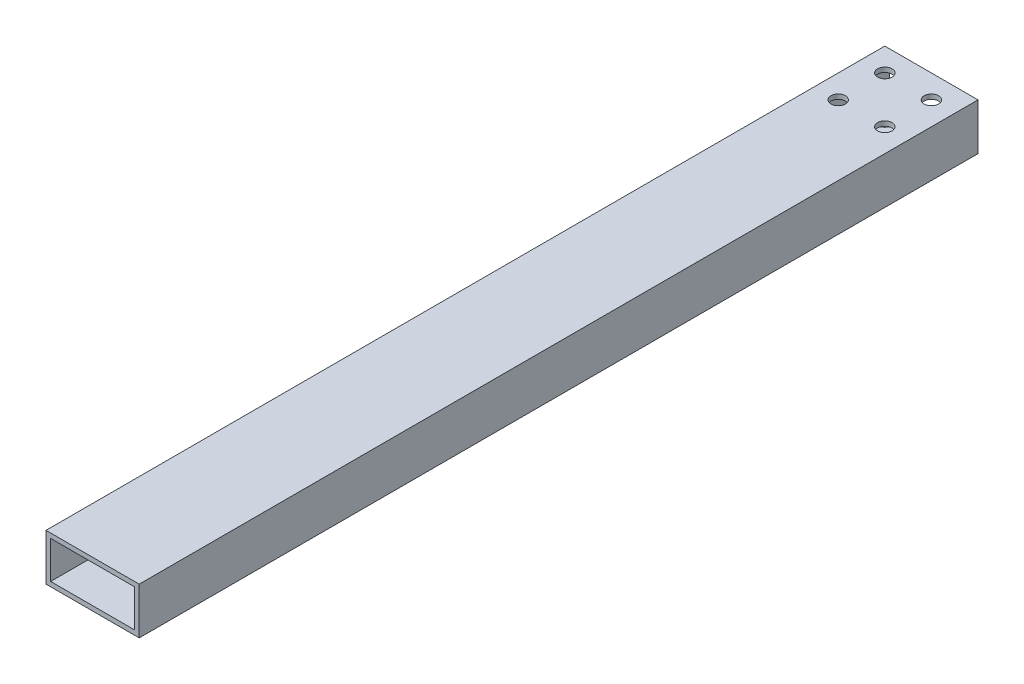
ISO-10303-21;
HEADER;
FILE_DESCRIPTION(('STEP AP214'),'2;1');
FILE_NAME('part.step','',(''),(''),'','','');
FILE_SCHEMA(('AUTOMOTIVE_DESIGN { 1 0 10303 214 1 1 1 1 }'));
ENDSEC;
DATA;
#1=APPLICATION_CONTEXT('core data for automotive mechanical design processes');
#2=APPLICATION_PROTOCOL_DEFINITION('international standard','automotive_design',2000,#1);
#3=PRODUCT_CONTEXT('',#1,'mechanical');
#4=PRODUCT('Part','Part','',(#3));
#5=PRODUCT_RELATED_PRODUCT_CATEGORY('part','',(#4));
#6=PRODUCT_DEFINITION_FORMATION('','',#4);
#7=PRODUCT_DEFINITION_CONTEXT('part definition',#1,'design');
#8=PRODUCT_DEFINITION('design','',#6,#7);
#9=PRODUCT_DEFINITION_SHAPE('','',#8);
#10=(LENGTH_UNIT() NAMED_UNIT(*) SI_UNIT(.MILLI.,.METRE.));
#11=(NAMED_UNIT(*) PLANE_ANGLE_UNIT() SI_UNIT($,.RADIAN.));
#12=(NAMED_UNIT(*) SI_UNIT($,.STERADIAN.) SOLID_ANGLE_UNIT());
#13=UNCERTAINTY_MEASURE_WITH_UNIT(LENGTH_MEASURE(1.E-05),#10,'distance_accuracy_value','');
#14=(GEOMETRIC_REPRESENTATION_CONTEXT(3) GLOBAL_UNCERTAINTY_ASSIGNED_CONTEXT((#13)) GLOBAL_UNIT_ASSIGNED_CONTEXT((#10,
#11,#12)) REPRESENTATION_CONTEXT('',''));
#15=CARTESIAN_POINT('',(0.,0.,0.));
#16=DIRECTION('',(0.,0.,1.));
#17=DIRECTION('',(1.,0.,0.));
#18=AXIS2_PLACEMENT_3D('',#15,#16,#17);
#19=CARTESIAN_POINT('',(0.,0.,180.));
#20=DIRECTION('',(0.,0.,-1.));
#21=DIRECTION('',(-1.,0.,0.));
#22=AXIS2_PLACEMENT_3D('',#19,#20,#21);
#23=PLANE('',#22);
#24=DIRECTION('',(0.,-1.,0.));
#25=VECTOR('',#24,1.);
#26=CARTESIAN_POINT('',(0.,0.,180.));
#27=LINE('',#26,#25);
#28=CARTESIAN_POINT('',(0.,10.,180.));
#29=VERTEX_POINT('',#28);
#30=CARTESIAN_POINT('',(0.,0.,180.));
#31=VERTEX_POINT('',#30);
#32=EDGE_CURVE('E146',#29,#31,#27,.T.);
#33=ORIENTED_EDGE('',*,*,#32,.T.);
#34=DIRECTION('',(1.,0.,0.));
#35=VECTOR('',#34,1.);
#36=CARTESIAN_POINT('',(0.,0.,180.));
#37=LINE('',#36,#35);
#38=CARTESIAN_POINT('',(20.,0.,180.));
#39=VERTEX_POINT('',#38);
#40=EDGE_CURVE('E149',#31,#39,#37,.T.);
#41=ORIENTED_EDGE('',*,*,#40,.T.);
#42=DIRECTION('',(0.,1.,0.));
#43=VECTOR('',#42,1.);
#44=CARTESIAN_POINT('',(20.,0.,180.));
#45=LINE('',#44,#43);
#46=CARTESIAN_POINT('',(20.,10.,180.));
#47=VERTEX_POINT('',#46);
#48=EDGE_CURVE('E152',#39,#47,#45,.T.);
#49=ORIENTED_EDGE('',*,*,#48,.T.);
#50=DIRECTION('',(-1.,0.,0.));
#51=VECTOR('',#50,1.);
#52=CARTESIAN_POINT('',(0.,10.,180.));
#53=LINE('',#52,#51);
#54=EDGE_CURVE('E154',#47,#29,#53,.T.);
#55=ORIENTED_EDGE('',*,*,#54,.T.);
#56=EDGE_LOOP('',(#33,#41,#49,#55));
#57=FACE_BOUND('',#56,.T.);
#58=DIRECTION('',(1.,0.,0.));
#59=VECTOR('',#58,1.);
#60=CARTESIAN_POINT('',(1.,1.,180.));
#61=LINE('',#60,#59);
#62=CARTESIAN_POINT('',(1.,1.,180.));
#63=VERTEX_POINT('',#62);
#64=CARTESIAN_POINT('',(19.,1.,180.));
#65=VERTEX_POINT('',#64);
#66=EDGE_CURVE('E108',#63,#65,#61,.T.);
#67=ORIENTED_EDGE('',*,*,#66,.F.);
#68=DIRECTION('',(0.,-1.,0.));
#69=VECTOR('',#68,1.);
#70=CARTESIAN_POINT('',(1.,1.,180.));
#71=LINE('',#70,#69);
#72=CARTESIAN_POINT('',(1.,9.,180.));
#73=VERTEX_POINT('',#72);
#74=EDGE_CURVE('E130',#73,#63,#71,.T.);
#75=ORIENTED_EDGE('',*,*,#74,.F.);
#76=DIRECTION('',(-1.,0.,0.));
#77=VECTOR('',#76,1.);
#78=CARTESIAN_POINT('',(1.,9.,180.));
#79=LINE('',#78,#77);
#80=CARTESIAN_POINT('',(19.,9.,180.));
#81=VERTEX_POINT('',#80);
#82=EDGE_CURVE('E128',#81,#73,#79,.T.);
#83=ORIENTED_EDGE('',*,*,#82,.F.);
#84=DIRECTION('',(0.,1.,0.));
#85=VECTOR('',#84,1.);
#86=CARTESIAN_POINT('',(19.,1.,180.));
#87=LINE('',#86,#85);
#88=EDGE_CURVE('E116',#65,#81,#87,.T.);
#89=ORIENTED_EDGE('',*,*,#88,.F.);
#90=EDGE_LOOP('',(#67,#75,#83,#89));
#91=FACE_BOUND('',#90,.T.);
#92=ADVANCED_FACE('F41',(#57,#91),#23,.F.);
#93=CARTESIAN_POINT('',(0.,0.,0.));
#94=DIRECTION('',(0.,0.,-1.));
#95=DIRECTION('',(-1.,0.,0.));
#96=AXIS2_PLACEMENT_3D('',#93,#94,#95);
#97=PLANE('',#96);
#98=DIRECTION('',(0.,-1.,0.));
#99=VECTOR('',#98,1.);
#100=CARTESIAN_POINT('',(0.,0.,0.));
#101=LINE('',#100,#99);
#102=CARTESIAN_POINT('',(0.,10.,0.));
#103=VERTEX_POINT('',#102);
#104=CARTESIAN_POINT('',(0.,0.,0.));
#105=VERTEX_POINT('',#104);
#106=EDGE_CURVE('E124',#103,#105,#101,.T.);
#107=ORIENTED_EDGE('',*,*,#106,.F.);
#108=DIRECTION('',(-1.,0.,0.));
#109=VECTOR('',#108,1.);
#110=CARTESIAN_POINT('',(0.,10.,0.));
#111=LINE('',#110,#109);
#112=CARTESIAN_POINT('',(20.,10.,0.));
#113=VERTEX_POINT('',#112);
#114=EDGE_CURVE('E150',#113,#103,#111,.T.);
#115=ORIENTED_EDGE('',*,*,#114,.F.);
#116=DIRECTION('',(0.,1.,0.));
#117=VECTOR('',#116,1.);
#118=CARTESIAN_POINT('',(20.,0.,0.));
#119=LINE('',#118,#117);
#120=CARTESIAN_POINT('',(20.,0.,0.));
#121=VERTEX_POINT('',#120);
#122=EDGE_CURVE('E161',#121,#113,#119,.T.);
#123=ORIENTED_EDGE('',*,*,#122,.F.);
#124=DIRECTION('',(1.,0.,0.));
#125=VECTOR('',#124,1.);
#126=CARTESIAN_POINT('',(0.,0.,0.));
#127=LINE('',#126,#125);
#128=EDGE_CURVE('E159',#105,#121,#127,.T.);
#129=ORIENTED_EDGE('',*,*,#128,.F.);
#130=EDGE_LOOP('',(#107,#115,#123,#129));
#131=FACE_BOUND('',#130,.T.);
#132=DIRECTION('',(0.,-1.,0.));
#133=VECTOR('',#132,1.);
#134=CARTESIAN_POINT('',(1.,1.,0.));
#135=LINE('',#134,#133);
#136=CARTESIAN_POINT('',(1.,9.,0.));
#137=VERTEX_POINT('',#136);
#138=CARTESIAN_POINT('',(1.,1.,0.));
#139=VERTEX_POINT('',#138);
#140=EDGE_CURVE('E117',#137,#139,#135,.T.);
#141=ORIENTED_EDGE('',*,*,#140,.T.);
#142=DIRECTION('',(1.,0.,0.));
#143=VECTOR('',#142,1.);
#144=CARTESIAN_POINT('',(1.,1.,0.));
#145=LINE('',#144,#143);
#146=CARTESIAN_POINT('',(19.,1.,0.));
#147=VERTEX_POINT('',#146);
#148=EDGE_CURVE('E66',#139,#147,#145,.T.);
#149=ORIENTED_EDGE('',*,*,#148,.T.);
#150=DIRECTION('',(0.,1.,0.));
#151=VECTOR('',#150,1.);
#152=CARTESIAN_POINT('',(19.,1.,0.));
#153=LINE('',#152,#151);
#154=CARTESIAN_POINT('',(19.,9.,0.));
#155=VERTEX_POINT('',#154);
#156=EDGE_CURVE('E123',#147,#155,#153,.T.);
#157=ORIENTED_EDGE('',*,*,#156,.T.);
#158=DIRECTION('',(-1.,0.,0.));
#159=VECTOR('',#158,1.);
#160=CARTESIAN_POINT('',(1.,9.,0.));
#161=LINE('',#160,#159);
#162=EDGE_CURVE('E138',#155,#137,#161,.T.);
#163=ORIENTED_EDGE('',*,*,#162,.T.);
#164=EDGE_LOOP('',(#141,#149,#157,#163));
#165=FACE_BOUND('',#164,.T.);
#166=ADVANCED_FACE('F213',(#131,#165),#97,.T.);
#167=CARTESIAN_POINT('',(0.,0.,180.));
#168=DIRECTION('',(1.,0.,0.));
#169=DIRECTION('',(0.,0.,-1.));
#170=AXIS2_PLACEMENT_3D('',#167,#168,#169);
#171=PLANE('',#170);
#172=ORIENTED_EDGE('',*,*,#106,.T.);
#173=DIRECTION('',(0.,0.,-1.));
#174=VECTOR('',#173,1.);
#175=CARTESIAN_POINT('',(0.,0.,180.));
#176=LINE('',#175,#174);
#177=EDGE_CURVE('E11',#31,#105,#176,.T.);
#178=ORIENTED_EDGE('',*,*,#177,.F.);
#179=ORIENTED_EDGE('',*,*,#32,.F.);
#180=DIRECTION('',(0.,0.,-1.));
#181=VECTOR('',#180,1.);
#182=CARTESIAN_POINT('',(0.,10.,180.));
#183=LINE('',#182,#181);
#184=EDGE_CURVE('E156',#29,#103,#183,.T.);
#185=ORIENTED_EDGE('',*,*,#184,.T.);
#186=EDGE_LOOP('',(#172,#178,#179,#185));
#187=FACE_BOUND('',#186,.T.);
#188=ADVANCED_FACE('F43',(#187),#171,.F.);
#189=CARTESIAN_POINT('',(0.,0.,180.));
#190=DIRECTION('',(0.,1.,0.));
#191=DIRECTION('',(0.,0.,1.));
#192=AXIS2_PLACEMENT_3D('',#189,#190,#191);
#193=PLANE('',#192);
#194=CARTESIAN_POINT('',(4.99999999999997,0.,15.));
#195=DIRECTION('',(0.,-1.,0.));
#196=DIRECTION('',(0.,0.,-1.));
#197=AXIS2_PLACEMENT_3D('',#194,#195,#196);
#198=CIRCLE('',#197,1.55);
#199=CARTESIAN_POINT('',(4.99999999999997,0.,13.45));
#200=VERTEX_POINT('',#199);
#201=EDGE_CURVE('E253',#200,#200,#198,.T.);
#202=ORIENTED_EDGE('',*,*,#201,.F.);
#203=EDGE_LOOP('',(#202));
#204=FACE_BOUND('',#203,.T.);
#205=CARTESIAN_POINT('',(15.,0.,15.0000000000001));
#206=DIRECTION('',(0.,-1.,0.));
#207=DIRECTION('',(0.,0.,-1.));
#208=AXIS2_PLACEMENT_3D('',#205,#206,#207);
#209=CIRCLE('',#208,1.55);
#210=CARTESIAN_POINT('',(15.,0.,13.4500000000001));
#211=VERTEX_POINT('',#210);
#212=EDGE_CURVE('E257',#211,#211,#209,.T.);
#213=ORIENTED_EDGE('',*,*,#212,.F.);
#214=EDGE_LOOP('',(#213));
#215=FACE_BOUND('',#214,.T.);
#216=CARTESIAN_POINT('',(15.,0.,5.00000000000014));
#217=DIRECTION('',(0.,-1.,0.));
#218=DIRECTION('',(0.,0.,-1.));
#219=AXIS2_PLACEMENT_3D('',#216,#217,#218);
#220=CIRCLE('',#219,1.55);
#221=CARTESIAN_POINT('',(15.,0.,3.45000000000014));
#222=VERTEX_POINT('',#221);
#223=EDGE_CURVE('E261',#222,#222,#220,.T.);
#224=ORIENTED_EDGE('',*,*,#223,.F.);
#225=EDGE_LOOP('',(#224));
#226=FACE_BOUND('',#225,.T.);
#227=CARTESIAN_POINT('',(5.,0.,5.));
#228=DIRECTION('',(0.,-1.,0.));
#229=DIRECTION('',(0.,0.,-1.));
#230=AXIS2_PLACEMENT_3D('',#227,#228,#229);
#231=CIRCLE('',#230,1.55);
#232=CARTESIAN_POINT('',(5.,0.,3.45));
#233=VERTEX_POINT('',#232);
#234=EDGE_CURVE('E265',#233,#233,#231,.T.);
#235=ORIENTED_EDGE('',*,*,#234,.F.);
#236=EDGE_LOOP('',(#235));
#237=FACE_BOUND('',#236,.T.);
#238=ORIENTED_EDGE('',*,*,#128,.T.);
#239=DIRECTION('',(0.,0.,-1.));
#240=VECTOR('',#239,1.);
#241=CARTESIAN_POINT('',(20.,0.,180.));
#242=LINE('',#241,#240);
#243=EDGE_CURVE('E50',#39,#121,#242,.T.);
#244=ORIENTED_EDGE('',*,*,#243,.F.);
#245=ORIENTED_EDGE('',*,*,#40,.F.);
#246=ORIENTED_EDGE('',*,*,#177,.T.);
#247=EDGE_LOOP('',(#238,#244,#245,#246));
#248=FACE_BOUND('',#247,.T.);
#249=ADVANCED_FACE('F243',(#204,#215,#226,#237,#248),#193,.F.);
#250=CARTESIAN_POINT('',(20.,0.,180.));
#251=DIRECTION('',(-1.,0.,0.));
#252=DIRECTION('',(0.,0.,1.));
#253=AXIS2_PLACEMENT_3D('',#250,#251,#252);
#254=PLANE('',#253);
#255=ORIENTED_EDGE('',*,*,#122,.T.);
#256=DIRECTION('',(0.,0.,-1.));
#257=VECTOR('',#256,1.);
#258=CARTESIAN_POINT('',(20.,10.,180.));
#259=LINE('',#258,#257);
#260=EDGE_CURVE('E166',#47,#113,#259,.T.);
#261=ORIENTED_EDGE('',*,*,#260,.F.);
#262=ORIENTED_EDGE('',*,*,#48,.F.);
#263=ORIENTED_EDGE('',*,*,#243,.T.);
#264=EDGE_LOOP('',(#255,#261,#262,#263));
#265=FACE_BOUND('',#264,.T.);
#266=ADVANCED_FACE('F240',(#265),#254,.F.);
#267=CARTESIAN_POINT('',(0.,10.,180.));
#268=DIRECTION('',(0.,-1.,0.));
#269=DIRECTION('',(0.,0.,-1.));
#270=AXIS2_PLACEMENT_3D('',#267,#268,#269);
#271=PLANE('',#270);
#272=CARTESIAN_POINT('',(4.99999999999997,10.,15.));
#273=DIRECTION('',(0.,-1.,0.));
#274=DIRECTION('',(0.,0.,-1.));
#275=AXIS2_PLACEMENT_3D('',#272,#273,#274);
#276=CIRCLE('',#275,1.55);
#277=CARTESIAN_POINT('',(4.99999999999997,10.,13.45));
#278=VERTEX_POINT('',#277);
#279=EDGE_CURVE('E283',#278,#278,#276,.T.);
#280=ORIENTED_EDGE('',*,*,#279,.T.);
#281=EDGE_LOOP('',(#280));
#282=FACE_BOUND('',#281,.T.);
#283=CARTESIAN_POINT('',(15.,10.,15.0000000000001));
#284=DIRECTION('',(0.,-1.,0.));
#285=DIRECTION('',(0.,0.,-1.));
#286=AXIS2_PLACEMENT_3D('',#283,#284,#285);
#287=CIRCLE('',#286,1.55);
#288=CARTESIAN_POINT('',(15.,10.,13.4500000000001));
#289=VERTEX_POINT('',#288);
#290=EDGE_CURVE('E287',#289,#289,#287,.T.);
#291=ORIENTED_EDGE('',*,*,#290,.T.);
#292=EDGE_LOOP('',(#291));
#293=FACE_BOUND('',#292,.T.);
#294=CARTESIAN_POINT('',(15.,10.,5.00000000000014));
#295=DIRECTION('',(0.,-1.,0.));
#296=DIRECTION('',(0.,0.,-1.));
#297=AXIS2_PLACEMENT_3D('',#294,#295,#296);
#298=CIRCLE('',#297,1.55);
#299=CARTESIAN_POINT('',(15.,10.,3.45000000000014));
#300=VERTEX_POINT('',#299);
#301=EDGE_CURVE('E280',#300,#300,#298,.T.);
#302=ORIENTED_EDGE('',*,*,#301,.T.);
#303=EDGE_LOOP('',(#302));
#304=FACE_BOUND('',#303,.T.);
#305=CARTESIAN_POINT('',(5.,10.,5.));
#306=DIRECTION('',(0.,-1.,0.));
#307=DIRECTION('',(0.,0.,-1.));
#308=AXIS2_PLACEMENT_3D('',#305,#306,#307);
#309=CIRCLE('',#308,1.55);
#310=CARTESIAN_POINT('',(5.,10.,3.45));
#311=VERTEX_POINT('',#310);
#312=EDGE_CURVE('E175',#311,#311,#309,.T.);
#313=ORIENTED_EDGE('',*,*,#312,.T.);
#314=EDGE_LOOP('',(#313));
#315=FACE_BOUND('',#314,.T.);
#316=ORIENTED_EDGE('',*,*,#114,.T.);
#317=ORIENTED_EDGE('',*,*,#184,.F.);
#318=ORIENTED_EDGE('',*,*,#54,.F.);
#319=ORIENTED_EDGE('',*,*,#260,.T.);
#320=EDGE_LOOP('',(#316,#317,#318,#319));
#321=FACE_BOUND('',#320,.T.);
#322=ADVANCED_FACE('F237',(#282,#293,#304,#315,#321),#271,.F.);
#323=CARTESIAN_POINT('',(1.,1.,180.));
#324=DIRECTION('',(0.,1.,0.));
#325=DIRECTION('',(0.,0.,1.));
#326=AXIS2_PLACEMENT_3D('',#323,#324,#325);
#327=PLANE('',#326);
#328=CARTESIAN_POINT('',(4.99999999999997,0.999999999999999,15.));
#329=DIRECTION('',(0.,1.,0.));
#330=DIRECTION('',(0.,0.,1.));
#331=AXIS2_PLACEMENT_3D('',#328,#329,#330);
#332=CIRCLE('',#331,1.55);
#333=CARTESIAN_POINT('',(4.99999999999997,0.999999999999999,16.55));
#334=VERTEX_POINT('',#333);
#335=EDGE_CURVE('E136',#334,#334,#332,.T.);
#336=ORIENTED_EDGE('',*,*,#335,.F.);
#337=EDGE_LOOP('',(#336));
#338=FACE_BOUND('',#337,.T.);
#339=CARTESIAN_POINT('',(15.,0.999999999999999,15.0000000000001));
#340=DIRECTION('',(0.,1.,0.));
#341=DIRECTION('',(0.,0.,1.));
#342=AXIS2_PLACEMENT_3D('',#339,#340,#341);
#343=CIRCLE('',#342,1.55);
#344=CARTESIAN_POINT('',(15.,0.999999999999999,16.5500000000001));
#345=VERTEX_POINT('',#344);
#346=EDGE_CURVE('E181',#345,#345,#343,.T.);
#347=ORIENTED_EDGE('',*,*,#346,.F.);
#348=EDGE_LOOP('',(#347));
#349=FACE_BOUND('',#348,.T.);
#350=CARTESIAN_POINT('',(15.,0.999999999999999,5.00000000000014));
#351=DIRECTION('',(0.,1.,0.));
#352=DIRECTION('',(0.,0.,1.));
#353=AXIS2_PLACEMENT_3D('',#350,#351,#352);
#354=CIRCLE('',#353,1.55);
#355=CARTESIAN_POINT('',(15.,0.999999999999999,6.55000000000015));
#356=VERTEX_POINT('',#355);
#357=EDGE_CURVE('E178',#356,#356,#354,.T.);
#358=ORIENTED_EDGE('',*,*,#357,.F.);
#359=EDGE_LOOP('',(#358));
#360=FACE_BOUND('',#359,.T.);
#361=CARTESIAN_POINT('',(5.,0.999999999999999,5.));
#362=DIRECTION('',(0.,1.,0.));
#363=DIRECTION('',(0.,0.,1.));
#364=AXIS2_PLACEMENT_3D('',#361,#362,#363);
#365=CIRCLE('',#364,1.55);
#366=CARTESIAN_POINT('',(5.,0.999999999999999,6.55));
#367=VERTEX_POINT('',#366);
#368=EDGE_CURVE('E174',#367,#367,#365,.T.);
#369=ORIENTED_EDGE('',*,*,#368,.F.);
#370=EDGE_LOOP('',(#369));
#371=FACE_BOUND('',#370,.T.);
#372=ORIENTED_EDGE('',*,*,#148,.F.);
#373=DIRECTION('',(0.,0.,-1.));
#374=VECTOR('',#373,1.);
#375=CARTESIAN_POINT('',(1.,1.,180.));
#376=LINE('',#375,#374);
#377=EDGE_CURVE('E112',#63,#139,#376,.T.);
#378=ORIENTED_EDGE('',*,*,#377,.F.);
#379=ORIENTED_EDGE('',*,*,#66,.T.);
#380=DIRECTION('',(0.,0.,-1.));
#381=VECTOR('',#380,1.);
#382=CARTESIAN_POINT('',(19.,1.,180.));
#383=LINE('',#382,#381);
#384=EDGE_CURVE('E111',#65,#147,#383,.T.);
#385=ORIENTED_EDGE('',*,*,#384,.T.);
#386=EDGE_LOOP('',(#372,#378,#379,#385));
#387=FACE_BOUND('',#386,.T.);
#388=ADVANCED_FACE('F110',(#338,#349,#360,#371,#387),#327,.T.);
#389=CARTESIAN_POINT('',(19.,1.,180.));
#390=DIRECTION('',(-1.,0.,0.));
#391=DIRECTION('',(0.,0.,1.));
#392=AXIS2_PLACEMENT_3D('',#389,#390,#391);
#393=PLANE('',#392);
#394=ORIENTED_EDGE('',*,*,#156,.F.);
#395=ORIENTED_EDGE('',*,*,#384,.F.);
#396=ORIENTED_EDGE('',*,*,#88,.T.);
#397=DIRECTION('',(0.,0.,-1.));
#398=VECTOR('',#397,1.);
#399=CARTESIAN_POINT('',(19.,9.,180.));
#400=LINE('',#399,#398);
#401=EDGE_CURVE('E125',#81,#155,#400,.T.);
#402=ORIENTED_EDGE('',*,*,#401,.T.);
#403=EDGE_LOOP('',(#394,#395,#396,#402));
#404=FACE_BOUND('',#403,.T.);
#405=ADVANCED_FACE('F120',(#404),#393,.T.);
#406=CARTESIAN_POINT('',(1.,9.,180.));
#407=DIRECTION('',(0.,-1.,0.));
#408=DIRECTION('',(0.,0.,-1.));
#409=AXIS2_PLACEMENT_3D('',#406,#407,#408);
#410=PLANE('',#409);
#411=CARTESIAN_POINT('',(4.99999999999997,9.,15.));
#412=DIRECTION('',(0.,-1.,0.));
#413=DIRECTION('',(0.,0.,-1.));
#414=AXIS2_PLACEMENT_3D('',#411,#412,#413);
#415=CIRCLE('',#414,1.55);
#416=CARTESIAN_POINT('',(4.99999999999997,9.,13.45));
#417=VERTEX_POINT('',#416);
#418=EDGE_CURVE('E45',#417,#417,#415,.T.);
#419=ORIENTED_EDGE('',*,*,#418,.F.);
#420=EDGE_LOOP('',(#419));
#421=FACE_BOUND('',#420,.T.);
#422=CARTESIAN_POINT('',(15.,9.,15.0000000000001));
#423=DIRECTION('',(0.,-1.,0.));
#424=DIRECTION('',(0.,0.,-1.));
#425=AXIS2_PLACEMENT_3D('',#422,#423,#424);
#426=CIRCLE('',#425,1.55);
#427=CARTESIAN_POINT('',(15.,9.,13.4500000000001));
#428=VERTEX_POINT('',#427);
#429=EDGE_CURVE('E179',#428,#428,#426,.T.);
#430=ORIENTED_EDGE('',*,*,#429,.F.);
#431=EDGE_LOOP('',(#430));
#432=FACE_BOUND('',#431,.T.);
#433=CARTESIAN_POINT('',(15.,9.,5.00000000000014));
#434=DIRECTION('',(0.,-1.,0.));
#435=DIRECTION('',(0.,0.,-1.));
#436=AXIS2_PLACEMENT_3D('',#433,#434,#435);
#437=CIRCLE('',#436,1.55);
#438=CARTESIAN_POINT('',(15.,9.,3.45000000000014));
#439=VERTEX_POINT('',#438);
#440=EDGE_CURVE('E176',#439,#439,#437,.T.);
#441=ORIENTED_EDGE('',*,*,#440,.F.);
#442=EDGE_LOOP('',(#441));
#443=FACE_BOUND('',#442,.T.);
#444=CARTESIAN_POINT('',(5.,9.,5.));
#445=DIRECTION('',(0.,-1.,0.));
#446=DIRECTION('',(0.,0.,-1.));
#447=AXIS2_PLACEMENT_3D('',#444,#445,#446);
#448=CIRCLE('',#447,1.55);
#449=CARTESIAN_POINT('',(5.,9.,3.45));
#450=VERTEX_POINT('',#449);
#451=EDGE_CURVE('E171',#450,#450,#448,.T.);
#452=ORIENTED_EDGE('',*,*,#451,.F.);
#453=EDGE_LOOP('',(#452));
#454=FACE_BOUND('',#453,.T.);
#455=ORIENTED_EDGE('',*,*,#162,.F.);
#456=ORIENTED_EDGE('',*,*,#401,.F.);
#457=ORIENTED_EDGE('',*,*,#82,.T.);
#458=DIRECTION('',(0.,0.,-1.));
#459=VECTOR('',#458,1.);
#460=CARTESIAN_POINT('',(1.,9.,180.));
#461=LINE('',#460,#459);
#462=EDGE_CURVE('E58',#73,#137,#461,.T.);
#463=ORIENTED_EDGE('',*,*,#462,.T.);
#464=EDGE_LOOP('',(#455,#456,#457,#463));
#465=FACE_BOUND('',#464,.T.);
#466=ADVANCED_FACE('F201',(#421,#432,#443,#454,#465),#410,.T.);
#467=CARTESIAN_POINT('',(1.,1.,180.));
#468=DIRECTION('',(1.,0.,0.));
#469=DIRECTION('',(0.,0.,-1.));
#470=AXIS2_PLACEMENT_3D('',#467,#468,#469);
#471=PLANE('',#470);
#472=ORIENTED_EDGE('',*,*,#140,.F.);
#473=ORIENTED_EDGE('',*,*,#462,.F.);
#474=ORIENTED_EDGE('',*,*,#74,.T.);
#475=ORIENTED_EDGE('',*,*,#377,.T.);
#476=EDGE_LOOP('',(#472,#473,#474,#475));
#477=FACE_BOUND('',#476,.T.);
#478=ADVANCED_FACE('F204',(#477),#471,.T.);
#479=CARTESIAN_POINT('',(5.,10.,5.));
#480=DIRECTION('',(0.,-1.,0.));
#481=DIRECTION('',(0.,0.,-1.));
#482=AXIS2_PLACEMENT_3D('',#479,#480,#481);
#483=CYLINDRICAL_SURFACE('',#482,1.55);
#484=ORIENTED_EDGE('',*,*,#451,.T.);
#485=EDGE_LOOP('',(#484));
#486=FACE_BOUND('',#485,.T.);
#487=ORIENTED_EDGE('',*,*,#312,.F.);
#488=EDGE_LOOP('',(#487));
#489=FACE_BOUND('',#488,.T.);
#490=ADVANCED_FACE('F215',(#486,#489),#483,.F.);
#491=CARTESIAN_POINT('',(15.,10.,5.00000000000014));
#492=DIRECTION('',(0.,-1.,0.));
#493=DIRECTION('',(0.,0.,-1.));
#494=AXIS2_PLACEMENT_3D('',#491,#492,#493);
#495=CYLINDRICAL_SURFACE('',#494,1.55);
#496=ORIENTED_EDGE('',*,*,#440,.T.);
#497=EDGE_LOOP('',(#496));
#498=FACE_BOUND('',#497,.T.);
#499=ORIENTED_EDGE('',*,*,#301,.F.);
#500=EDGE_LOOP('',(#499));
#501=FACE_BOUND('',#500,.T.);
#502=ADVANCED_FACE('F222',(#498,#501),#495,.F.);
#503=CARTESIAN_POINT('',(15.,10.,15.0000000000001));
#504=DIRECTION('',(0.,-1.,0.));
#505=DIRECTION('',(0.,0.,-1.));
#506=AXIS2_PLACEMENT_3D('',#503,#504,#505);
#507=CYLINDRICAL_SURFACE('',#506,1.55);
#508=ORIENTED_EDGE('',*,*,#429,.T.);
#509=EDGE_LOOP('',(#508));
#510=FACE_BOUND('',#509,.T.);
#511=ORIENTED_EDGE('',*,*,#290,.F.);
#512=EDGE_LOOP('',(#511));
#513=FACE_BOUND('',#512,.T.);
#514=ADVANCED_FACE('F297',(#510,#513),#507,.F.);
#515=CARTESIAN_POINT('',(4.99999999999997,10.,15.));
#516=DIRECTION('',(0.,-1.,0.));
#517=DIRECTION('',(0.,0.,-1.));
#518=AXIS2_PLACEMENT_3D('',#515,#516,#517);
#519=CYLINDRICAL_SURFACE('',#518,1.55);
#520=ORIENTED_EDGE('',*,*,#418,.T.);
#521=EDGE_LOOP('',(#520));
#522=FACE_BOUND('',#521,.T.);
#523=ORIENTED_EDGE('',*,*,#279,.F.);
#524=EDGE_LOOP('',(#523));
#525=FACE_BOUND('',#524,.T.);
#526=ADVANCED_FACE('F198',(#522,#525),#519,.F.);
#527=ORIENTED_EDGE('',*,*,#368,.T.);
#528=EDGE_LOOP('',(#527));
#529=FACE_BOUND('',#528,.T.);
#530=ORIENTED_EDGE('',*,*,#234,.T.);
#531=EDGE_LOOP('',(#530));
#532=FACE_BOUND('',#531,.T.);
#533=ADVANCED_FACE('F225',(#529,#532),#483,.F.);
#534=ORIENTED_EDGE('',*,*,#357,.T.);
#535=EDGE_LOOP('',(#534));
#536=FACE_BOUND('',#535,.T.);
#537=ORIENTED_EDGE('',*,*,#223,.T.);
#538=EDGE_LOOP('',(#537));
#539=FACE_BOUND('',#538,.T.);
#540=ADVANCED_FACE('F300',(#536,#539),#495,.F.);
#541=ORIENTED_EDGE('',*,*,#346,.T.);
#542=EDGE_LOOP('',(#541));
#543=FACE_BOUND('',#542,.T.);
#544=ORIENTED_EDGE('',*,*,#212,.T.);
#545=EDGE_LOOP('',(#544));
#546=FACE_BOUND('',#545,.T.);
#547=ADVANCED_FACE('F305',(#543,#546),#507,.F.);
#548=ORIENTED_EDGE('',*,*,#335,.T.);
#549=EDGE_LOOP('',(#548));
#550=FACE_BOUND('',#549,.T.);
#551=ORIENTED_EDGE('',*,*,#201,.T.);
#552=EDGE_LOOP('',(#551));
#553=FACE_BOUND('',#552,.T.);
#554=ADVANCED_FACE('F311',(#550,#553),#519,.F.);
#555=CLOSED_SHELL('',(#92,#166,#188,#249,#266,#322,#388,#405,#466,#478,#490,#502,#514,#526,#533,
#540,#547,#554));
#556=MANIFOLD_SOLID_BREP('B2',#555);
#557=ADVANCED_BREP_SHAPE_REPRESENTATION('',(#18,#556),#14);
#558=SHAPE_DEFINITION_REPRESENTATION(#9,#557);
ENDSEC;
END-ISO-10303-21;
